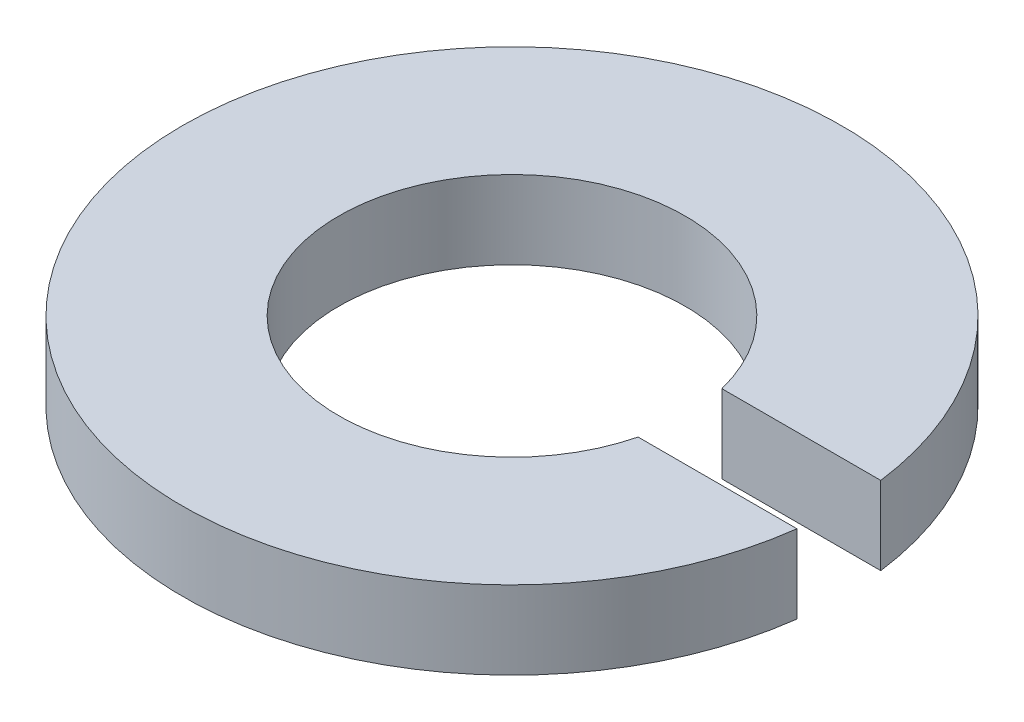
ISO-10303-21;
HEADER;
FILE_DESCRIPTION(('STEP AP214'),'2;1');
FILE_NAME('part.step','',(''),(''),'','','');
FILE_SCHEMA(('AUTOMOTIVE_DESIGN { 1 0 10303 214 1 1 1 1 }'));
ENDSEC;
DATA;
#1=APPLICATION_CONTEXT('core data for automotive mechanical design processes');
#2=APPLICATION_PROTOCOL_DEFINITION('international standard','automotive_design',2000,#1);
#3=PRODUCT_CONTEXT('',#1,'mechanical');
#4=PRODUCT('Part','Part','',(#3));
#5=PRODUCT_RELATED_PRODUCT_CATEGORY('part','',(#4));
#6=PRODUCT_DEFINITION_FORMATION('','',#4);
#7=PRODUCT_DEFINITION_CONTEXT('part definition',#1,'design');
#8=PRODUCT_DEFINITION('design','',#6,#7);
#9=PRODUCT_DEFINITION_SHAPE('','',#8);
#10=(LENGTH_UNIT() NAMED_UNIT(*) SI_UNIT(.MILLI.,.METRE.));
#11=(NAMED_UNIT(*) PLANE_ANGLE_UNIT() SI_UNIT($,.RADIAN.));
#12=(NAMED_UNIT(*) SI_UNIT($,.STERADIAN.) SOLID_ANGLE_UNIT());
#13=UNCERTAINTY_MEASURE_WITH_UNIT(LENGTH_MEASURE(1.E-05),#10,'distance_accuracy_value','');
#14=(GEOMETRIC_REPRESENTATION_CONTEXT(3) GLOBAL_UNCERTAINTY_ASSIGNED_CONTEXT((#13)) GLOBAL_UNIT_ASSIGNED_CONTEXT((#10,
#11,#12)) REPRESENTATION_CONTEXT('',''));
#15=CARTESIAN_POINT('',(0.,0.,0.));
#16=DIRECTION('',(0.,0.,1.));
#17=DIRECTION('',(1.,0.,0.));
#18=AXIS2_PLACEMENT_3D('',#15,#16,#17);
#19=CARTESIAN_POINT('',(0.,0.7,0.));
#20=DIRECTION('',(0.,-1.,0.));
#21=DIRECTION('',(0.,0.,-1.));
#22=AXIS2_PLACEMENT_3D('',#19,#20,#21);
#23=CYLINDRICAL_SURFACE('',#22,1.55);
#24=CARTESIAN_POINT('',(0.,0.,0.));
#25=DIRECTION('',(0.,1.,0.));
#26=DIRECTION('',(0.,0.,1.));
#27=AXIS2_PLACEMENT_3D('',#24,#25,#26);
#28=CIRCLE('',#27,1.55);
#29=CARTESIAN_POINT('',(1.5039531242695,0.,-0.375));
#30=VERTEX_POINT('',#29);
#31=CARTESIAN_POINT('',(1.5039531242695,0.,0.375));
#32=VERTEX_POINT('',#31);
#33=EDGE_CURVE('E99',#30,#32,#28,.T.);
#34=ORIENTED_EDGE('',*,*,#33,.F.);
#35=DIRECTION('',(0.,-1.,0.));
#36=VECTOR('',#35,1.);
#37=CARTESIAN_POINT('',(1.5039531242695,0.7,-0.375));
#38=LINE('',#37,#36);
#39=CARTESIAN_POINT('',(1.5039531242695,0.7,-0.375));
#40=VERTEX_POINT('',#39);
#41=EDGE_CURVE('E11',#40,#30,#38,.T.);
#42=ORIENTED_EDGE('',*,*,#41,.F.);
#43=CARTESIAN_POINT('',(0.,0.7,0.));
#44=DIRECTION('',(0.,1.,0.));
#45=DIRECTION('',(0.,0.,1.));
#46=AXIS2_PLACEMENT_3D('',#43,#44,#45);
#47=CIRCLE('',#46,1.55);
#48=CARTESIAN_POINT('',(1.5039531242695,0.7,0.375));
#49=VERTEX_POINT('',#48);
#50=EDGE_CURVE('E84',#40,#49,#47,.T.);
#51=ORIENTED_EDGE('',*,*,#50,.T.);
#52=DIRECTION('',(0.,-1.,0.));
#53=VECTOR('',#52,1.);
#54=CARTESIAN_POINT('',(1.5039531242695,0.7,0.375));
#55=LINE('',#54,#53);
#56=EDGE_CURVE('E52',#49,#32,#55,.T.);
#57=ORIENTED_EDGE('',*,*,#56,.T.);
#58=EDGE_LOOP('',(#34,#42,#51,#57));
#59=FACE_BOUND('',#58,.T.);
#60=ADVANCED_FACE('F36',(#59),#23,.F.);
#61=CARTESIAN_POINT('',(0.,0.7,-0.375));
#62=DIRECTION('',(0.,0.,-1.));
#63=DIRECTION('',(-1.,0.,0.));
#64=AXIS2_PLACEMENT_3D('',#61,#62,#63);
#65=PLANE('',#64);
#66=DIRECTION('',(1.,0.,0.));
#67=VECTOR('',#66,1.);
#68=CARTESIAN_POINT('',(0.,0.,-0.375));
#69=LINE('',#68,#67);
#70=CARTESIAN_POINT('',(2.92606818102381,0.,-0.375));
#71=VERTEX_POINT('',#70);
#72=EDGE_CURVE('E90',#30,#71,#69,.T.);
#73=ORIENTED_EDGE('',*,*,#72,.T.);
#74=DIRECTION('',(0.,-1.,0.));
#75=VECTOR('',#74,1.);
#76=CARTESIAN_POINT('',(2.92606818102381,0.7,-0.375));
#77=LINE('',#76,#75);
#78=CARTESIAN_POINT('',(2.92606818102381,0.7,-0.375));
#79=VERTEX_POINT('',#78);
#80=EDGE_CURVE('E44',#79,#71,#77,.T.);
#81=ORIENTED_EDGE('',*,*,#80,.F.);
#82=DIRECTION('',(1.,0.,0.));
#83=VECTOR('',#82,1.);
#84=CARTESIAN_POINT('',(0.,0.7,-0.375));
#85=LINE('',#84,#83);
#86=EDGE_CURVE('E78',#40,#79,#85,.T.);
#87=ORIENTED_EDGE('',*,*,#86,.F.);
#88=ORIENTED_EDGE('',*,*,#41,.T.);
#89=EDGE_LOOP('',(#73,#81,#87,#88));
#90=FACE_BOUND('',#89,.T.);
#91=ADVANCED_FACE('F88',(#90),#65,.F.);
#92=CARTESIAN_POINT('',(0.,0.7,0.));
#93=DIRECTION('',(0.,-1.,0.));
#94=DIRECTION('',(0.,0.,-1.));
#95=AXIS2_PLACEMENT_3D('',#92,#93,#94);
#96=CYLINDRICAL_SURFACE('',#95,2.95);
#97=CARTESIAN_POINT('',(0.,0.,0.));
#98=DIRECTION('',(0.,1.,0.));
#99=DIRECTION('',(0.,0.,1.));
#100=AXIS2_PLACEMENT_3D('',#97,#98,#99);
#101=CIRCLE('',#100,2.95);
#102=CARTESIAN_POINT('',(2.92606818102381,0.,0.375));
#103=VERTEX_POINT('',#102);
#104=EDGE_CURVE('E102',#71,#103,#101,.T.);
#105=ORIENTED_EDGE('',*,*,#104,.T.);
#106=DIRECTION('',(0.,-1.,0.));
#107=VECTOR('',#106,1.);
#108=CARTESIAN_POINT('',(2.92606818102381,0.7,0.375));
#109=LINE('',#108,#107);
#110=CARTESIAN_POINT('',(2.92606818102381,0.7,0.375));
#111=VERTEX_POINT('',#110);
#112=EDGE_CURVE('E66',#111,#103,#109,.T.);
#113=ORIENTED_EDGE('',*,*,#112,.F.);
#114=CARTESIAN_POINT('',(0.,0.7,0.));
#115=DIRECTION('',(0.,1.,0.));
#116=DIRECTION('',(0.,0.,1.));
#117=AXIS2_PLACEMENT_3D('',#114,#115,#116);
#118=CIRCLE('',#117,2.95);
#119=EDGE_CURVE('E83',#79,#111,#118,.T.);
#120=ORIENTED_EDGE('',*,*,#119,.F.);
#121=ORIENTED_EDGE('',*,*,#80,.T.);
#122=EDGE_LOOP('',(#105,#113,#120,#121));
#123=FACE_BOUND('',#122,.T.);
#124=ADVANCED_FACE('F93',(#123),#96,.T.);
#125=CARTESIAN_POINT('',(0.,0.7,0.375));
#126=DIRECTION('',(0.,0.,-1.));
#127=DIRECTION('',(-1.,0.,0.));
#128=AXIS2_PLACEMENT_3D('',#125,#126,#127);
#129=PLANE('',#128);
#130=DIRECTION('',(1.,0.,0.));
#131=VECTOR('',#130,1.);
#132=CARTESIAN_POINT('',(0.,0.,0.375));
#133=LINE('',#132,#131);
#134=EDGE_CURVE('E104',#32,#103,#133,.T.);
#135=ORIENTED_EDGE('',*,*,#134,.F.);
#136=ORIENTED_EDGE('',*,*,#56,.F.);
#137=DIRECTION('',(1.,0.,0.));
#138=VECTOR('',#137,1.);
#139=CARTESIAN_POINT('',(0.,0.7,0.375));
#140=LINE('',#139,#138);
#141=EDGE_CURVE('E94',#49,#111,#140,.T.);
#142=ORIENTED_EDGE('',*,*,#141,.T.);
#143=ORIENTED_EDGE('',*,*,#112,.T.);
#144=EDGE_LOOP('',(#135,#136,#142,#143));
#145=FACE_BOUND('',#144,.T.);
#146=ADVANCED_FACE('F109',(#145),#129,.T.);
#147=CARTESIAN_POINT('',(0.,0.7,0.));
#148=DIRECTION('',(0.,1.,0.));
#149=DIRECTION('',(0.,0.,1.));
#150=AXIS2_PLACEMENT_3D('',#147,#148,#149);
#151=PLANE('',#150);
#152=ORIENTED_EDGE('',*,*,#50,.F.);
#153=ORIENTED_EDGE('',*,*,#86,.T.);
#154=ORIENTED_EDGE('',*,*,#119,.T.);
#155=ORIENTED_EDGE('',*,*,#141,.F.);
#156=EDGE_LOOP('',(#152,#153,#154,#155));
#157=FACE_BOUND('',#156,.T.);
#158=ADVANCED_FACE('F80',(#157),#151,.T.);
#159=CARTESIAN_POINT('',(0.,0.,0.));
#160=DIRECTION('',(0.,1.,0.));
#161=DIRECTION('',(0.,0.,1.));
#162=AXIS2_PLACEMENT_3D('',#159,#160,#161);
#163=PLANE('',#162);
#164=ORIENTED_EDGE('',*,*,#33,.T.);
#165=ORIENTED_EDGE('',*,*,#134,.T.);
#166=ORIENTED_EDGE('',*,*,#104,.F.);
#167=ORIENTED_EDGE('',*,*,#72,.F.);
#168=EDGE_LOOP('',(#164,#165,#166,#167));
#169=FACE_BOUND('',#168,.T.);
#170=ADVANCED_FACE('F116',(#169),#163,.F.);
#171=CLOSED_SHELL('',(#60,#91,#124,#146,#158,#170));
#172=MANIFOLD_SOLID_BREP('B2',#171);
#173=ADVANCED_BREP_SHAPE_REPRESENTATION('',(#18,#172),#14);
#174=SHAPE_DEFINITION_REPRESENTATION(#9,#173);
ENDSEC;
END-ISO-10303-21;
